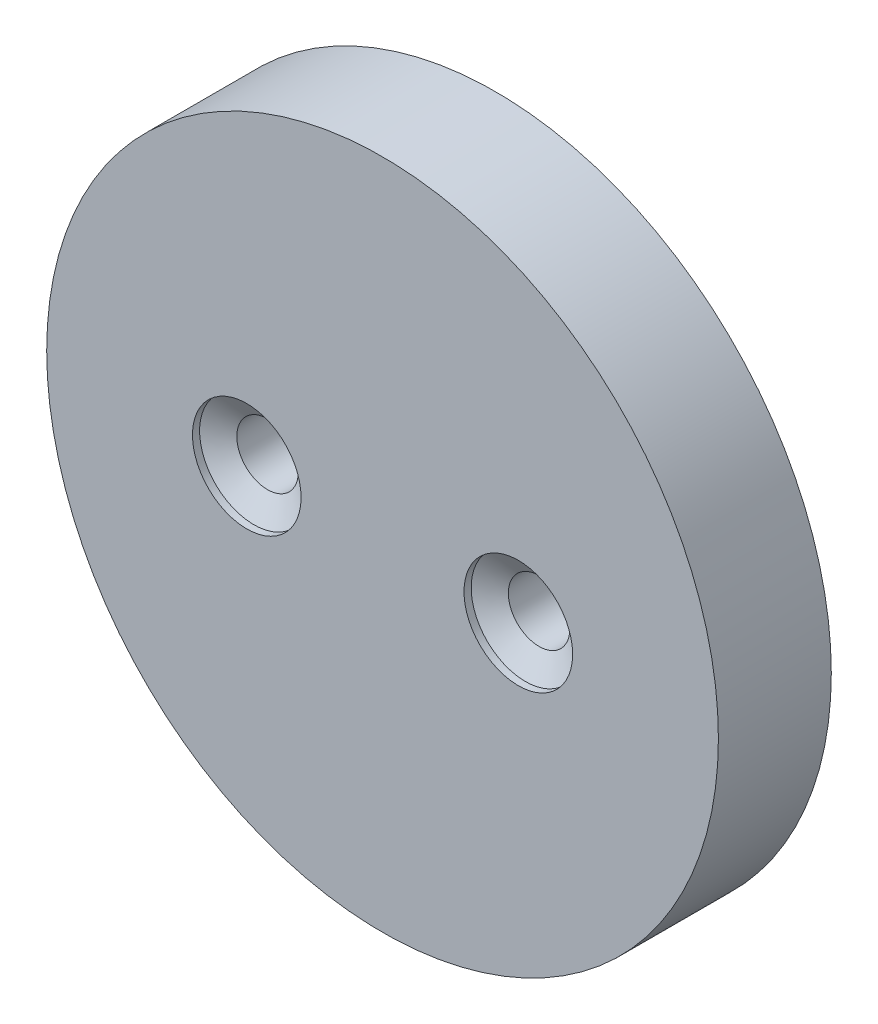
ISO-10303-21;
HEADER;
FILE_DESCRIPTION(('STEP AP214'),'2;1');
FILE_NAME('part.step','',(''),(''),'','','');
FILE_SCHEMA(('AUTOMOTIVE_DESIGN { 1 0 10303 214 1 1 1 1 }'));
ENDSEC;
DATA;
#1=APPLICATION_CONTEXT('core data for automotive mechanical design processes');
#2=APPLICATION_PROTOCOL_DEFINITION('international standard','automotive_design',2000,#1);
#3=PRODUCT_CONTEXT('',#1,'mechanical');
#4=PRODUCT('Part','Part','',(#3));
#5=PRODUCT_RELATED_PRODUCT_CATEGORY('part','',(#4));
#6=PRODUCT_DEFINITION_FORMATION('','',#4);
#7=PRODUCT_DEFINITION_CONTEXT('part definition',#1,'design');
#8=PRODUCT_DEFINITION('design','',#6,#7);
#9=PRODUCT_DEFINITION_SHAPE('','',#8);
#10=(LENGTH_UNIT() NAMED_UNIT(*) SI_UNIT(.MILLI.,.METRE.));
#11=(NAMED_UNIT(*) PLANE_ANGLE_UNIT() SI_UNIT($,.RADIAN.));
#12=(NAMED_UNIT(*) SI_UNIT($,.STERADIAN.) SOLID_ANGLE_UNIT());
#13=UNCERTAINTY_MEASURE_WITH_UNIT(LENGTH_MEASURE(1.E-05),#10,'distance_accuracy_value','');
#14=(GEOMETRIC_REPRESENTATION_CONTEXT(3) GLOBAL_UNCERTAINTY_ASSIGNED_CONTEXT((#13)) GLOBAL_UNIT_ASSIGNED_CONTEXT((#10,
#11,#12)) REPRESENTATION_CONTEXT('',''));
#15=CARTESIAN_POINT('',(0.,0.,0.));
#16=DIRECTION('',(0.,0.,1.));
#17=DIRECTION('',(1.,0.,0.));
#18=AXIS2_PLACEMENT_3D('',#15,#16,#17);
#19=CARTESIAN_POINT('',(-9.5,0.,-0.000999999999999265));
#20=DIRECTION('',(0.,0.,1.));
#21=DIRECTION('',(1.,0.,0.));
#22=AXIS2_PLACEMENT_3D('',#19,#20,#21);
#23=CYLINDRICAL_SURFACE('',#22,2.15);
#24=CARTESIAN_POINT('',(-9.5,0.,0.));
#25=DIRECTION('',(0.,0.,1.));
#26=DIRECTION('',(1.,0.,0.));
#27=AXIS2_PLACEMENT_3D('',#24,#25,#26);
#28=CIRCLE('',#27,2.15);
#29=CARTESIAN_POINT('',(-7.35,0.,0.));
#30=VERTEX_POINT('',#29);
#31=EDGE_CURVE('E42',#30,#30,#28,.F.);
#32=ORIENTED_EDGE('',*,*,#31,.T.);
#33=EDGE_LOOP('',(#32));
#34=FACE_BOUND('',#33,.T.);
#35=CARTESIAN_POINT('',(-9.5,0.,6.44737205583713));
#36=DIRECTION('',(0.,0.,1.));
#37=DIRECTION('',(1.,0.,0.));
#38=AXIS2_PLACEMENT_3D('',#35,#36,#37);
#39=CIRCLE('',#38,2.15);
#40=CARTESIAN_POINT('',(-7.35,0.,6.44737205583713));
#41=VERTEX_POINT('',#40);
#42=EDGE_CURVE('E61',#41,#41,#39,.F.);
#43=ORIENTED_EDGE('',*,*,#42,.F.);
#44=EDGE_LOOP('',(#43));
#45=FACE_BOUND('',#44,.T.);
#46=ADVANCED_FACE('F31',(#34,#45),#23,.F.);
#47=CARTESIAN_POINT('',(9.5,0.,-0.000999999999999265));
#48=DIRECTION('',(0.,0.,1.));
#49=DIRECTION('',(1.,0.,0.));
#50=AXIS2_PLACEMENT_3D('',#47,#48,#49);
#51=CYLINDRICAL_SURFACE('',#50,2.15);
#52=CARTESIAN_POINT('',(9.5,0.,0.));
#53=DIRECTION('',(0.,0.,1.));
#54=DIRECTION('',(1.,0.,0.));
#55=AXIS2_PLACEMENT_3D('',#52,#53,#54);
#56=CIRCLE('',#55,2.15);
#57=CARTESIAN_POINT('',(11.65,0.,0.));
#58=VERTEX_POINT('',#57);
#59=EDGE_CURVE('E44',#58,#58,#56,.F.);
#60=ORIENTED_EDGE('',*,*,#59,.T.);
#61=EDGE_LOOP('',(#60));
#62=FACE_BOUND('',#61,.T.);
#63=CARTESIAN_POINT('',(9.5,0.,6.44737205583713));
#64=DIRECTION('',(0.,0.,1.));
#65=DIRECTION('',(1.,0.,0.));
#66=AXIS2_PLACEMENT_3D('',#63,#64,#65);
#67=CIRCLE('',#66,2.15);
#68=CARTESIAN_POINT('',(11.65,0.,6.44737205583713));
#69=VERTEX_POINT('',#68);
#70=EDGE_CURVE('E53',#69,#69,#67,.F.);
#71=ORIENTED_EDGE('',*,*,#70,.F.);
#72=EDGE_LOOP('',(#71));
#73=FACE_BOUND('',#72,.T.);
#74=ADVANCED_FACE('F97',(#62,#73),#51,.F.);
#75=CARTESIAN_POINT('',(0.,0.,7.9));
#76=DIRECTION('',(0.,0.,-1.));
#77=DIRECTION('',(-1.,0.,0.));
#78=AXIS2_PLACEMENT_3D('',#75,#76,#77);
#79=CYLINDRICAL_SURFACE('',#78,23.5);
#80=CARTESIAN_POINT('',(0.,0.,7.9));
#81=DIRECTION('',(0.,0.,1.));
#82=DIRECTION('',(1.,0.,0.));
#83=AXIS2_PLACEMENT_3D('',#80,#81,#82);
#84=CIRCLE('',#83,23.5);
#85=CARTESIAN_POINT('',(23.5,0.,7.9));
#86=VERTEX_POINT('',#85);
#87=EDGE_CURVE('E10',#86,#86,#84,.T.);
#88=ORIENTED_EDGE('',*,*,#87,.F.);
#89=EDGE_LOOP('',(#88));
#90=FACE_BOUND('',#89,.T.);
#91=CARTESIAN_POINT('',(0.,0.,0.));
#92=DIRECTION('',(0.,0.,1.));
#93=DIRECTION('',(1.,0.,0.));
#94=AXIS2_PLACEMENT_3D('',#91,#92,#93);
#95=CIRCLE('',#94,23.5);
#96=CARTESIAN_POINT('',(23.5,0.,0.));
#97=VERTEX_POINT('',#96);
#98=EDGE_CURVE('E35',#97,#97,#95,.T.);
#99=ORIENTED_EDGE('',*,*,#98,.T.);
#100=EDGE_LOOP('',(#99));
#101=FACE_BOUND('',#100,.T.);
#102=ADVANCED_FACE('F33',(#90,#101),#79,.T.);
#103=CARTESIAN_POINT('',(0.,0.,7.9));
#104=DIRECTION('',(0.,0.,1.));
#105=DIRECTION('',(1.,0.,0.));
#106=AXIS2_PLACEMENT_3D('',#103,#104,#105);
#107=PLANE('',#106);
#108=CARTESIAN_POINT('',(-9.5,0.,7.9));
#109=DIRECTION('',(0.,0.,1.));
#110=DIRECTION('',(1.,0.,0.));
#111=AXIS2_PLACEMENT_3D('',#108,#109,#110);
#112=CIRCLE('',#111,3.8);
#113=CARTESIAN_POINT('',(-5.7,0.,7.9));
#114=VERTEX_POINT('',#113);
#115=EDGE_CURVE('E47',#114,#114,#112,.T.);
#116=ORIENTED_EDGE('',*,*,#115,.F.);
#117=EDGE_LOOP('',(#116));
#118=FACE_BOUND('',#117,.T.);
#119=CARTESIAN_POINT('',(9.5,0.,7.9));
#120=DIRECTION('',(0.,0.,1.));
#121=DIRECTION('',(1.,0.,0.));
#122=AXIS2_PLACEMENT_3D('',#119,#120,#121);
#123=CIRCLE('',#122,3.8);
#124=CARTESIAN_POINT('',(13.3,0.,7.9));
#125=VERTEX_POINT('',#124);
#126=EDGE_CURVE('E50',#125,#125,#123,.T.);
#127=ORIENTED_EDGE('',*,*,#126,.F.);
#128=EDGE_LOOP('',(#127));
#129=FACE_BOUND('',#128,.T.);
#130=ORIENTED_EDGE('',*,*,#87,.T.);
#131=EDGE_LOOP('',(#130));
#132=FACE_BOUND('',#131,.T.);
#133=ADVANCED_FACE('F79',(#118,#129,#132),#107,.T.);
#134=CARTESIAN_POINT('',(0.,0.,0.));
#135=DIRECTION('',(0.,0.,1.));
#136=DIRECTION('',(1.,0.,0.));
#137=AXIS2_PLACEMENT_3D('',#134,#135,#136);
#138=PLANE('',#137);
#139=ORIENTED_EDGE('',*,*,#31,.F.);
#140=EDGE_LOOP('',(#139));
#141=FACE_BOUND('',#140,.T.);
#142=ORIENTED_EDGE('',*,*,#59,.F.);
#143=EDGE_LOOP('',(#142));
#144=FACE_BOUND('',#143,.T.);
#145=ORIENTED_EDGE('',*,*,#98,.F.);
#146=EDGE_LOOP('',(#145));
#147=FACE_BOUND('',#146,.T.);
#148=ADVANCED_FACE('F75',(#141,#144,#147),#138,.F.);
#149=CARTESIAN_POINT('',(-9.5,0.,7.4));
#150=DIRECTION('',(0.,0.,1.));
#151=DIRECTION('',(1.,0.,0.));
#152=AXIS2_PLACEMENT_3D('',#149,#150,#151);
#153=CYLINDRICAL_SURFACE('',#152,3.8);
#154=CARTESIAN_POINT('',(-9.5,0.,7.4));
#155=DIRECTION('',(0.,0.,1.));
#156=DIRECTION('',(1.,0.,0.));
#157=AXIS2_PLACEMENT_3D('',#154,#155,#156);
#158=CIRCLE('',#157,3.8);
#159=CARTESIAN_POINT('',(-5.7,0.,7.40000000000001));
#160=VERTEX_POINT('',#159);
#161=EDGE_CURVE('E64',#160,#160,#158,.T.);
#162=ORIENTED_EDGE('',*,*,#161,.F.);
#163=EDGE_LOOP('',(#162));
#164=FACE_BOUND('',#163,.T.);
#165=ORIENTED_EDGE('',*,*,#115,.T.);
#166=EDGE_LOOP('',(#165));
#167=FACE_BOUND('',#166,.T.);
#168=ADVANCED_FACE('F71',(#164,#167),#153,.F.);
#169=CARTESIAN_POINT('',(9.5,0.,7.4));
#170=DIRECTION('',(0.,0.,1.));
#171=DIRECTION('',(1.,0.,0.));
#172=AXIS2_PLACEMENT_3D('',#169,#170,#171);
#173=CYLINDRICAL_SURFACE('',#172,3.8);
#174=CARTESIAN_POINT('',(9.5,0.,7.4));
#175=DIRECTION('',(0.,0.,1.));
#176=DIRECTION('',(1.,0.,0.));
#177=AXIS2_PLACEMENT_3D('',#174,#175,#176);
#178=CIRCLE('',#177,3.8);
#179=CARTESIAN_POINT('',(13.3,0.,7.40000000000001));
#180=VERTEX_POINT('',#179);
#181=EDGE_CURVE('E58',#180,#180,#178,.T.);
#182=ORIENTED_EDGE('',*,*,#181,.F.);
#183=EDGE_LOOP('',(#182));
#184=FACE_BOUND('',#183,.T.);
#185=ORIENTED_EDGE('',*,*,#126,.T.);
#186=EDGE_LOOP('',(#185));
#187=FACE_BOUND('',#186,.T.);
#188=ADVANCED_FACE('F74',(#184,#187),#173,.F.);
#189=CARTESIAN_POINT('',(9.5,0.,5.20606897707945));
#190=DIRECTION('',(0.,0.,1.));
#191=DIRECTION('',(1.,0.,0.));
#192=AXIS2_PLACEMENT_3D('',#189,#190,#191);
#193=CONICAL_SURFACE('',#192,0.,1.0471975511966);
#194=ORIENTED_EDGE('',*,*,#181,.T.);
#195=EDGE_LOOP('',(#194));
#196=FACE_BOUND('',#195,.T.);
#197=ORIENTED_EDGE('',*,*,#70,.T.);
#198=EDGE_LOOP('',(#197));
#199=FACE_BOUND('',#198,.T.);
#200=ADVANCED_FACE('F86',(#196,#199),#193,.F.);
#201=CARTESIAN_POINT('',(-9.5,0.,5.20606897707945));
#202=DIRECTION('',(0.,0.,1.));
#203=DIRECTION('',(1.,0.,0.));
#204=AXIS2_PLACEMENT_3D('',#201,#202,#203);
#205=CONICAL_SURFACE('',#204,0.,1.0471975511966);
#206=ORIENTED_EDGE('',*,*,#161,.T.);
#207=EDGE_LOOP('',(#206));
#208=FACE_BOUND('',#207,.T.);
#209=ORIENTED_EDGE('',*,*,#42,.T.);
#210=EDGE_LOOP('',(#209));
#211=FACE_BOUND('',#210,.T.);
#212=ADVANCED_FACE('F68',(#208,#211),#205,.F.);
#213=CLOSED_SHELL('',(#46,#74,#102,#133,#148,#168,#188,#200,#212));
#214=MANIFOLD_SOLID_BREP('B2',#213);
#215=ADVANCED_BREP_SHAPE_REPRESENTATION('',(#18,#214),#14);
#216=SHAPE_DEFINITION_REPRESENTATION(#9,#215);
ENDSEC;
END-ISO-10303-21;
